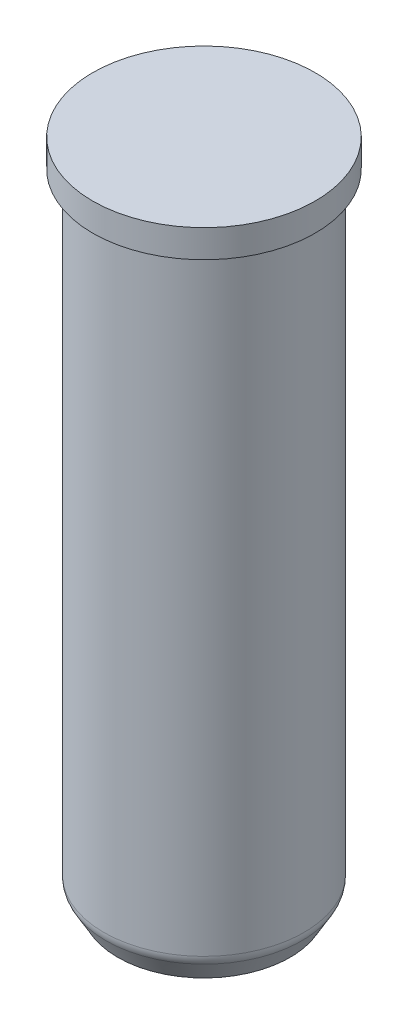
ISO-10303-21;
HEADER;
FILE_DESCRIPTION(('STEP AP214'),'2;1');
FILE_NAME('part.step','',(''),(''),'','','');
FILE_SCHEMA(('AUTOMOTIVE_DESIGN { 1 0 10303 214 1 1 1 1 }'));
ENDSEC;
DATA;
#1=APPLICATION_CONTEXT('core data for automotive mechanical design processes');
#2=APPLICATION_PROTOCOL_DEFINITION('international standard','automotive_design',2000,#1);
#3=PRODUCT_CONTEXT('',#1,'mechanical');
#4=PRODUCT('Part','Part','',(#3));
#5=PRODUCT_RELATED_PRODUCT_CATEGORY('part','',(#4));
#6=PRODUCT_DEFINITION_FORMATION('','',#4);
#7=PRODUCT_DEFINITION_CONTEXT('part definition',#1,'design');
#8=PRODUCT_DEFINITION('design','',#6,#7);
#9=PRODUCT_DEFINITION_SHAPE('','',#8);
#10=(LENGTH_UNIT() NAMED_UNIT(*) SI_UNIT(.MILLI.,.METRE.));
#11=(NAMED_UNIT(*) PLANE_ANGLE_UNIT() SI_UNIT($,.RADIAN.));
#12=(NAMED_UNIT(*) SI_UNIT($,.STERADIAN.) SOLID_ANGLE_UNIT());
#13=UNCERTAINTY_MEASURE_WITH_UNIT(LENGTH_MEASURE(1.E-05),#10,'distance_accuracy_value','');
#14=(GEOMETRIC_REPRESENTATION_CONTEXT(3) GLOBAL_UNCERTAINTY_ASSIGNED_CONTEXT((#13)) GLOBAL_UNIT_ASSIGNED_CONTEXT((#10,
#11,#12)) REPRESENTATION_CONTEXT('',''));
#15=CARTESIAN_POINT('',(0.,0.,0.));
#16=DIRECTION('',(0.,0.,1.));
#17=DIRECTION('',(1.,0.,0.));
#18=AXIS2_PLACEMENT_3D('',#15,#16,#17);
#19=CARTESIAN_POINT('',(0.,0.,0.));
#20=DIRECTION('',(0.,1.,0.));
#21=DIRECTION('',(0.,0.,1.));
#22=AXIS2_PLACEMENT_3D('',#19,#20,#21);
#23=PLANE('',#22);
#24=CARTESIAN_POINT('',(0.,0.,0.));
#25=DIRECTION('',(0.,1.,0.));
#26=DIRECTION('',(0.,0.,1.));
#27=AXIS2_PLACEMENT_3D('',#24,#25,#26);
#28=CIRCLE('',#27,1.55);
#29=CARTESIAN_POINT('',(0.,0.,1.55));
#30=VERTEX_POINT('',#29);
#31=EDGE_CURVE('E52',#30,#30,#28,.F.);
#32=ORIENTED_EDGE('',*,*,#31,.T.);
#33=EDGE_LOOP('',(#32));
#34=FACE_BOUND('',#33,.T.);
#35=CARTESIAN_POINT('',(0.,0.,0.));
#36=DIRECTION('',(0.,1.,0.));
#37=DIRECTION('',(0.,0.,1.));
#38=AXIS2_PLACEMENT_3D('',#35,#36,#37);
#39=CIRCLE('',#38,1.);
#40=CARTESIAN_POINT('',(0.,0.,1.));
#41=VERTEX_POINT('',#40);
#42=EDGE_CURVE('E63',#41,#41,#39,.T.);
#43=ORIENTED_EDGE('',*,*,#42,.T.);
#44=EDGE_LOOP('',(#43));
#45=FACE_BOUND('',#44,.T.);
#46=ADVANCED_FACE('F39',(#34,#45),#23,.F.);
#47=CARTESIAN_POINT('',(0.,11.5,0.));
#48=DIRECTION('',(0.,-1.,0.));
#49=DIRECTION('',(0.,0.,-1.));
#50=AXIS2_PLACEMENT_3D('',#47,#48,#49);
#51=CYLINDRICAL_SURFACE('',#50,1.8);
#52=CARTESIAN_POINT('',(0.,0.513397459621558,0.));
#53=DIRECTION('',(0.,-1.,0.));
#54=DIRECTION('',(0.,0.,-1.));
#55=AXIS2_PLACEMENT_3D('',#52,#53,#54);
#56=CIRCLE('',#55,1.8);
#57=CARTESIAN_POINT('',(0.,0.513397459621558,-1.8));
#58=VERTEX_POINT('',#57);
#59=EDGE_CURVE('E47',#58,#58,#56,.F.);
#60=ORIENTED_EDGE('',*,*,#59,.T.);
#61=EDGE_LOOP('',(#60));
#62=FACE_BOUND('',#61,.T.);
#63=CARTESIAN_POINT('',(0.,11.5,0.));
#64=DIRECTION('',(0.,1.,0.));
#65=DIRECTION('',(0.,0.,1.));
#66=AXIS2_PLACEMENT_3D('',#63,#64,#65);
#67=CIRCLE('',#66,1.8);
#68=CARTESIAN_POINT('',(0.,11.5,1.8));
#69=VERTEX_POINT('',#68);
#70=EDGE_CURVE('E57',#69,#69,#67,.T.);
#71=ORIENTED_EDGE('',*,*,#70,.F.);
#72=EDGE_LOOP('',(#71));
#73=FACE_BOUND('',#72,.T.);
#74=ADVANCED_FACE('F103',(#62,#73),#51,.T.);
#75=CARTESIAN_POINT('',(0.,11.5,0.));
#76=DIRECTION('',(0.,-1.,0.));
#77=DIRECTION('',(0.,0.,-1.));
#78=AXIS2_PLACEMENT_3D('',#75,#76,#77);
#79=CYLINDRICAL_SURFACE('',#78,1.);
#80=CARTESIAN_POINT('',(0.,11.5,0.));
#81=DIRECTION('',(0.,1.,0.));
#82=DIRECTION('',(0.,0.,1.));
#83=AXIS2_PLACEMENT_3D('',#80,#81,#82);
#84=CIRCLE('',#83,1.);
#85=CARTESIAN_POINT('',(0.,11.5,1.));
#86=VERTEX_POINT('',#85);
#87=EDGE_CURVE('E67',#86,#86,#84,.T.);
#88=ORIENTED_EDGE('',*,*,#87,.T.);
#89=EDGE_LOOP('',(#88));
#90=FACE_BOUND('',#89,.T.);
#91=ORIENTED_EDGE('',*,*,#42,.F.);
#92=EDGE_LOOP('',(#91));
#93=FACE_BOUND('',#92,.T.);
#94=ADVANCED_FACE('F100',(#90,#93),#79,.F.);
#95=CARTESIAN_POINT('',(0.,11.5,0.));
#96=DIRECTION('',(0.,1.,0.));
#97=DIRECTION('',(0.,0.,1.));
#98=AXIS2_PLACEMENT_3D('',#95,#96,#97);
#99=PLANE('',#98);
#100=ORIENTED_EDGE('',*,*,#87,.F.);
#101=EDGE_LOOP('',(#100));
#102=FACE_BOUND('',#101,.T.);
#103=ADVANCED_FACE('F85',(#102),#99,.F.);
#104=CARTESIAN_POINT('',(0.,12.,0.));
#105=DIRECTION('',(0.,-1.,0.));
#106=DIRECTION('',(0.,0.,-1.));
#107=AXIS2_PLACEMENT_3D('',#104,#105,#106);
#108=CYLINDRICAL_SURFACE('',#107,2.);
#109=CARTESIAN_POINT('',(0.,12.,0.));
#110=DIRECTION('',(0.,1.,0.));
#111=DIRECTION('',(0.,0.,1.));
#112=AXIS2_PLACEMENT_3D('',#109,#110,#111);
#113=CIRCLE('',#112,2.);
#114=CARTESIAN_POINT('',(0.,12.,2.));
#115=VERTEX_POINT('',#114);
#116=EDGE_CURVE('E71',#115,#115,#113,.T.);
#117=ORIENTED_EDGE('',*,*,#116,.F.);
#118=EDGE_LOOP('',(#117));
#119=FACE_BOUND('',#118,.T.);
#120=CARTESIAN_POINT('',(0.,11.5,0.));
#121=DIRECTION('',(0.,1.,0.));
#122=DIRECTION('',(0.,0.,1.));
#123=AXIS2_PLACEMENT_3D('',#120,#121,#122);
#124=CIRCLE('',#123,2.);
#125=CARTESIAN_POINT('',(0.,11.5,2.));
#126=VERTEX_POINT('',#125);
#127=EDGE_CURVE('E72',#126,#126,#124,.T.);
#128=ORIENTED_EDGE('',*,*,#127,.T.);
#129=EDGE_LOOP('',(#128));
#130=FACE_BOUND('',#129,.T.);
#131=ADVANCED_FACE('F82',(#119,#130),#108,.T.);
#132=CARTESIAN_POINT('',(0.,12.,0.));
#133=DIRECTION('',(0.,1.,0.));
#134=DIRECTION('',(0.,0.,1.));
#135=AXIS2_PLACEMENT_3D('',#132,#133,#134);
#136=PLANE('',#135);
#137=ORIENTED_EDGE('',*,*,#116,.T.);
#138=EDGE_LOOP('',(#137));
#139=FACE_BOUND('',#138,.T.);
#140=ADVANCED_FACE('F80',(#139),#136,.T.);
#141=ORIENTED_EDGE('',*,*,#70,.T.);
#142=EDGE_LOOP('',(#141));
#143=FACE_BOUND('',#142,.T.);
#144=ORIENTED_EDGE('',*,*,#127,.F.);
#145=EDGE_LOOP('',(#144));
#146=FACE_BOUND('',#145,.T.);
#147=ADVANCED_FACE('F89',(#143,#146),#99,.F.);
#148=CARTESIAN_POINT('',(0.,0.433012701892221,0.));
#149=DIRECTION('',(0.,1.,0.));
#150=DIRECTION('',(0.,0.,1.));
#151=AXIS2_PLACEMENT_3D('',#148,#149,#150);
#152=CONICAL_SURFACE('',#151,1.8,0.523598775598301);
#153=CARTESIAN_POINT('',(0.,0.363397459621558,0.));
#154=DIRECTION('',(0.,1.,0.));
#155=DIRECTION('',(0.,0.,1.));
#156=AXIS2_PLACEMENT_3D('',#153,#154,#155);
#157=CIRCLE('',#156,1.75980762113533);
#158=CARTESIAN_POINT('',(0.,0.363397459621558,1.75980762113533));
#159=VERTEX_POINT('',#158);
#160=EDGE_CURVE('E10',#159,#159,#157,.F.);
#161=ORIENTED_EDGE('',*,*,#160,.T.);
#162=EDGE_LOOP('',(#161));
#163=FACE_BOUND('',#162,.T.);
#164=ORIENTED_EDGE('',*,*,#31,.F.);
#165=EDGE_LOOP('',(#164));
#166=FACE_BOUND('',#165,.T.);
#167=ADVANCED_FACE('F91',(#163,#166),#152,.T.);
#168=CARTESIAN_POINT('',(0.,0.513397459621558,0.));
#169=DIRECTION('',(0.,-1.,0.));
#170=DIRECTION('',(0.,0.,-1.));
#171=AXIS2_PLACEMENT_3D('',#168,#169,#170);
#172=TOROIDAL_SURFACE('',#171,1.5,0.3);
#173=ORIENTED_EDGE('',*,*,#160,.F.);
#174=EDGE_LOOP('',(#173));
#175=FACE_BOUND('',#174,.T.);
#176=ORIENTED_EDGE('',*,*,#59,.F.);
#177=EDGE_LOOP('',(#176));
#178=FACE_BOUND('',#177,.T.);
#179=ADVANCED_FACE('F41',(#175,#178),#172,.T.);
#180=CLOSED_SHELL('',(#46,#74,#94,#103,#131,#140,#147,#167,#179));
#181=MANIFOLD_SOLID_BREP('B2',#180);
#182=ADVANCED_BREP_SHAPE_REPRESENTATION('',(#18,#181),#14);
#183=SHAPE_DEFINITION_REPRESENTATION(#9,#182);
ENDSEC;
END-ISO-10303-21;
